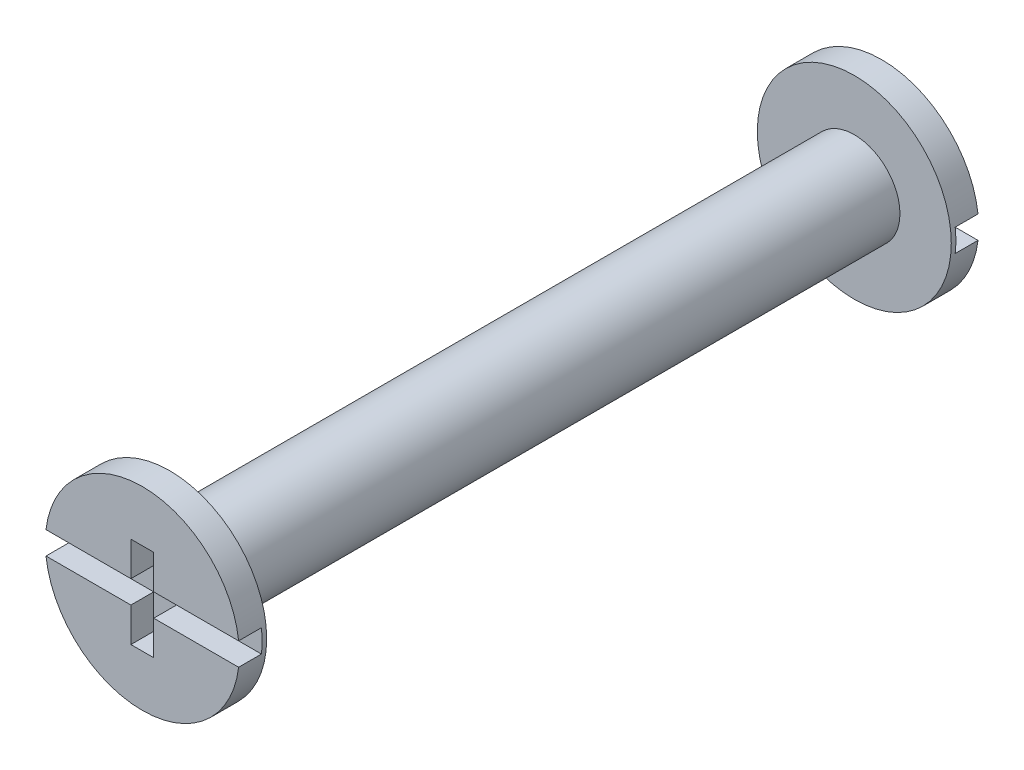
ISO-10303-21;
HEADER;
FILE_DESCRIPTION(('STEP AP214'),'2;1');
FILE_NAME('part.step','',(''),(''),'','','');
FILE_SCHEMA(('AUTOMOTIVE_DESIGN { 1 0 10303 214 1 1 1 1 }'));
ENDSEC;
DATA;
#1=APPLICATION_CONTEXT('core data for automotive mechanical design processes');
#2=APPLICATION_PROTOCOL_DEFINITION('international standard','automotive_design',2000,#1);
#3=PRODUCT_CONTEXT('',#1,'mechanical');
#4=PRODUCT('Part','Part','',(#3));
#5=PRODUCT_RELATED_PRODUCT_CATEGORY('part','',(#4));
#6=PRODUCT_DEFINITION_FORMATION('','',#4);
#7=PRODUCT_DEFINITION_CONTEXT('part definition',#1,'design');
#8=PRODUCT_DEFINITION('design','',#6,#7);
#9=PRODUCT_DEFINITION_SHAPE('','',#8);
#10=(LENGTH_UNIT() NAMED_UNIT(*) SI_UNIT(.MILLI.,.METRE.));
#11=(NAMED_UNIT(*) PLANE_ANGLE_UNIT() SI_UNIT($,.RADIAN.));
#12=(NAMED_UNIT(*) SI_UNIT($,.STERADIAN.) SOLID_ANGLE_UNIT());
#13=UNCERTAINTY_MEASURE_WITH_UNIT(LENGTH_MEASURE(1.E-05),#10,'distance_accuracy_value','');
#14=(GEOMETRIC_REPRESENTATION_CONTEXT(3) GLOBAL_UNCERTAINTY_ASSIGNED_CONTEXT((#13)) GLOBAL_UNIT_ASSIGNED_CONTEXT((#10,
#11,#12)) REPRESENTATION_CONTEXT('',''));
#15=CARTESIAN_POINT('',(0.,0.,0.));
#16=DIRECTION('',(0.,0.,1.));
#17=DIRECTION('',(1.,0.,0.));
#18=AXIS2_PLACEMENT_3D('',#15,#16,#17);
#19=CARTESIAN_POINT('',(0.,0.,0.));
#20=DIRECTION('',(0.,0.,1.));
#21=DIRECTION('',(1.,0.,0.));
#22=AXIS2_PLACEMENT_3D('',#19,#20,#21);
#23=PLANE('',#22);
#24=CARTESIAN_POINT('',(0.,0.,0.));
#25=DIRECTION('',(0.,0.,1.));
#26=DIRECTION('',(1.,0.,0.));
#27=AXIS2_PLACEMENT_3D('',#24,#25,#26);
#28=CIRCLE('',#27,4.25);
#29=CARTESIAN_POINT('',(4.22048575403353,0.5,0.));
#30=VERTEX_POINT('',#29);
#31=CARTESIAN_POINT('',(-4.22048575403353,0.5,0.));
#32=VERTEX_POINT('',#31);
#33=EDGE_CURVE('E166',#30,#32,#28,.T.);
#34=ORIENTED_EDGE('',*,*,#33,.F.);
#35=DIRECTION('',(-1.,0.,0.));
#36=VECTOR('',#35,1.);
#37=CARTESIAN_POINT('',(0.,0.5,0.));
#38=LINE('',#37,#36);
#39=EDGE_CURVE('E154',#30,#32,#38,.T.);
#40=ORIENTED_EDGE('',*,*,#39,.T.);
#41=EDGE_LOOP('',(#34,#40));
#42=FACE_BOUND('',#41,.T.);
#43=ADVANCED_FACE('F35',(#42),#23,.F.);
#44=CARTESIAN_POINT('',(0.,0.,32.4));
#45=DIRECTION('',(0.,0.,1.));
#46=DIRECTION('',(1.,0.,0.));
#47=AXIS2_PLACEMENT_3D('',#44,#45,#46);
#48=PLANE('',#47);
#49=DIRECTION('',(1.,0.,0.));
#50=VECTOR('',#49,1.);
#51=CARTESIAN_POINT('',(0.5,-0.5,32.4));
#52=LINE('',#51,#50);
#53=CARTESIAN_POINT('',(0.5,-0.5,32.4));
#54=VERTEX_POINT('',#53);
#55=CARTESIAN_POINT('',(4.22048575403353,-0.5,32.4));
#56=VERTEX_POINT('',#55);
#57=EDGE_CURVE('E204',#54,#56,#52,.T.);
#58=ORIENTED_EDGE('',*,*,#57,.F.);
#59=DIRECTION('',(0.,1.,0.));
#60=VECTOR('',#59,1.);
#61=CARTESIAN_POINT('',(0.5,-0.5,32.4));
#62=LINE('',#61,#60);
#63=CARTESIAN_POINT('',(0.5,-2.,32.4));
#64=VERTEX_POINT('',#63);
#65=EDGE_CURVE('E247',#64,#54,#62,.T.);
#66=ORIENTED_EDGE('',*,*,#65,.F.);
#67=DIRECTION('',(1.,0.,0.));
#68=VECTOR('',#67,1.);
#69=CARTESIAN_POINT('',(-0.5,-2.,32.4));
#70=LINE('',#69,#68);
#71=CARTESIAN_POINT('',(-0.5,-2.,32.4));
#72=VERTEX_POINT('',#71);
#73=EDGE_CURVE('E244',#72,#64,#70,.T.);
#74=ORIENTED_EDGE('',*,*,#73,.F.);
#75=DIRECTION('',(0.,-1.,0.));
#76=VECTOR('',#75,1.);
#77=CARTESIAN_POINT('',(-0.5,-0.5,32.4));
#78=LINE('',#77,#76);
#79=CARTESIAN_POINT('',(-0.5,-0.5,32.4));
#80=VERTEX_POINT('',#79);
#81=EDGE_CURVE('E241',#80,#72,#78,.T.);
#82=ORIENTED_EDGE('',*,*,#81,.F.);
#83=DIRECTION('',(1.,0.,0.));
#84=VECTOR('',#83,1.);
#85=CARTESIAN_POINT('',(0.,-0.5,32.4));
#86=LINE('',#85,#84);
#87=CARTESIAN_POINT('',(-4.22048575403353,-0.5,32.4));
#88=VERTEX_POINT('',#87);
#89=EDGE_CURVE('E179',#88,#80,#86,.T.);
#90=ORIENTED_EDGE('',*,*,#89,.F.);
#91=CARTESIAN_POINT('',(0.,0.,32.4));
#92=DIRECTION('',(0.,0.,1.));
#93=DIRECTION('',(1.,0.,0.));
#94=AXIS2_PLACEMENT_3D('',#91,#92,#93);
#95=CIRCLE('',#94,4.25);
#96=EDGE_CURVE('E282',#88,#56,#95,.T.);
#97=ORIENTED_EDGE('',*,*,#96,.T.);
#98=EDGE_LOOP('',(#58,#66,#74,#82,#90,#97));
#99=FACE_BOUND('',#98,.T.);
#100=ADVANCED_FACE('F291',(#99),#48,.T.);
#101=CARTESIAN_POINT('',(0.,0.,1.2));
#102=DIRECTION('',(0.,0.,1.));
#103=DIRECTION('',(1.,0.,0.));
#104=AXIS2_PLACEMENT_3D('',#101,#102,#103);
#105=PLANE('',#104);
#106=CARTESIAN_POINT('',(0.,0.,1.2));
#107=DIRECTION('',(0.,0.,1.));
#108=DIRECTION('',(1.,0.,0.));
#109=AXIS2_PLACEMENT_3D('',#106,#107,#108);
#110=CIRCLE('',#109,4.25);
#111=CARTESIAN_POINT('',(4.25,0.,1.2));
#112=VERTEX_POINT('',#111);
#113=EDGE_CURVE('E170',#112,#112,#110,.T.);
#114=ORIENTED_EDGE('',*,*,#113,.T.);
#115=EDGE_LOOP('',(#114));
#116=FACE_BOUND('',#115,.T.);
#117=CARTESIAN_POINT('',(0.,0.,1.2));
#118=DIRECTION('',(0.,0.,1.));
#119=DIRECTION('',(1.,0.,0.));
#120=AXIS2_PLACEMENT_3D('',#117,#118,#119);
#121=CIRCLE('',#120,2.);
#122=CARTESIAN_POINT('',(2.,0.,1.2));
#123=VERTEX_POINT('',#122);
#124=EDGE_CURVE('E172',#123,#123,#121,.T.);
#125=ORIENTED_EDGE('',*,*,#124,.F.);
#126=EDGE_LOOP('',(#125));
#127=FACE_BOUND('',#126,.T.);
#128=ADVANCED_FACE('F289',(#116,#127),#105,.T.);
#129=CARTESIAN_POINT('',(0.,0.,1.2));
#130=DIRECTION('',(0.,0.,-1.));
#131=DIRECTION('',(-1.,0.,0.));
#132=AXIS2_PLACEMENT_3D('',#129,#130,#131);
#133=CYLINDRICAL_SURFACE('',#132,4.25);
#134=CARTESIAN_POINT('',(0.,0.,1.));
#135=DIRECTION('',(0.,0.,-1.));
#136=DIRECTION('',(-1.,0.,0.));
#137=AXIS2_PLACEMENT_3D('',#134,#135,#136);
#138=CIRCLE('',#137,4.25);
#139=CARTESIAN_POINT('',(4.22048575403353,0.5,1.));
#140=VERTEX_POINT('',#139);
#141=CARTESIAN_POINT('',(4.22048575403353,-0.5,1.));
#142=VERTEX_POINT('',#141);
#143=EDGE_CURVE('E11',#140,#142,#138,.T.);
#144=ORIENTED_EDGE('',*,*,#143,.F.);
#145=DIRECTION('',(0.,0.,-1.));
#146=VECTOR('',#145,1.);
#147=CARTESIAN_POINT('',(4.22048575403353,0.5,1.2));
#148=LINE('',#147,#146);
#149=EDGE_CURVE('E194',#140,#30,#148,.T.);
#150=ORIENTED_EDGE('',*,*,#149,.T.);
#151=ORIENTED_EDGE('',*,*,#33,.T.);
#152=DIRECTION('',(0.,0.,-1.));
#153=VECTOR('',#152,1.);
#154=CARTESIAN_POINT('',(-4.22048575403353,0.5,1.2));
#155=LINE('',#154,#153);
#156=CARTESIAN_POINT('',(-4.22048575403353,0.5,1.));
#157=VERTEX_POINT('',#156);
#158=EDGE_CURVE('E163',#32,#157,#155,.F.);
#159=ORIENTED_EDGE('',*,*,#158,.T.);
#160=CARTESIAN_POINT('',(-4.22048575403353,-0.5,1.));
#161=VERTEX_POINT('',#160);
#162=EDGE_CURVE('E39',#161,#157,#138,.T.);
#163=ORIENTED_EDGE('',*,*,#162,.F.);
#164=DIRECTION('',(0.,0.,-1.));
#165=VECTOR('',#164,1.);
#166=CARTESIAN_POINT('',(-4.22048575403353,-0.5,1.2));
#167=LINE('',#166,#165);
#168=CARTESIAN_POINT('',(-4.22048575403353,-0.5,0.));
#169=VERTEX_POINT('',#168);
#170=EDGE_CURVE('E149',#161,#169,#167,.T.);
#171=ORIENTED_EDGE('',*,*,#170,.T.);
#172=CARTESIAN_POINT('',(4.22048575403353,-0.5,0.));
#173=VERTEX_POINT('',#172);
#174=EDGE_CURVE('E161',#169,#173,#28,.T.);
#175=ORIENTED_EDGE('',*,*,#174,.T.);
#176=DIRECTION('',(0.,0.,-1.));
#177=VECTOR('',#176,1.);
#178=CARTESIAN_POINT('',(4.22048575403353,-0.5,1.2));
#179=LINE('',#178,#177);
#180=EDGE_CURVE('E50',#173,#142,#179,.F.);
#181=ORIENTED_EDGE('',*,*,#180,.T.);
#182=EDGE_LOOP('',(#144,#150,#151,#159,#163,#171,#175,#181));
#183=FACE_BOUND('',#182,.T.);
#184=ORIENTED_EDGE('',*,*,#113,.F.);
#185=EDGE_LOOP('',(#184));
#186=FACE_BOUND('',#185,.T.);
#187=ADVANCED_FACE('F37',(#183,#186),#133,.T.);
#188=ORIENTED_EDGE('',*,*,#174,.F.);
#189=DIRECTION('',(1.,0.,0.));
#190=VECTOR('',#189,1.);
#191=CARTESIAN_POINT('',(0.,-0.5,0.));
#192=LINE('',#191,#190);
#193=EDGE_CURVE('E146',#169,#173,#192,.T.);
#194=ORIENTED_EDGE('',*,*,#193,.T.);
#195=EDGE_LOOP('',(#188,#194));
#196=FACE_BOUND('',#195,.T.);
#197=ADVANCED_FACE('F165',(#196),#23,.F.);
#198=CARTESIAN_POINT('',(0.,0.,31.2));
#199=DIRECTION('',(0.,0.,-1.));
#200=DIRECTION('',(-1.,0.,0.));
#201=AXIS2_PLACEMENT_3D('',#198,#199,#200);
#202=CYLINDRICAL_SURFACE('',#201,2.);
#203=CARTESIAN_POINT('',(0.,0.,31.2));
#204=DIRECTION('',(0.,0.,1.));
#205=DIRECTION('',(1.,0.,0.));
#206=AXIS2_PLACEMENT_3D('',#203,#204,#205);
#207=CIRCLE('',#206,2.);
#208=CARTESIAN_POINT('',(2.,0.,31.2));
#209=VERTEX_POINT('',#208);
#210=EDGE_CURVE('E167',#209,#209,#207,.T.);
#211=ORIENTED_EDGE('',*,*,#210,.F.);
#212=EDGE_LOOP('',(#211));
#213=FACE_BOUND('',#212,.T.);
#214=ORIENTED_EDGE('',*,*,#124,.T.);
#215=EDGE_LOOP('',(#214));
#216=FACE_BOUND('',#215,.T.);
#217=ADVANCED_FACE('F287',(#213,#216),#202,.T.);
#218=CARTESIAN_POINT('',(0.,0.,31.2));
#219=DIRECTION('',(0.,0.,1.));
#220=DIRECTION('',(1.,0.,0.));
#221=AXIS2_PLACEMENT_3D('',#218,#219,#220);
#222=PLANE('',#221);
#223=CARTESIAN_POINT('',(0.,0.,31.2));
#224=DIRECTION('',(0.,0.,1.));
#225=DIRECTION('',(1.,0.,0.));
#226=AXIS2_PLACEMENT_3D('',#223,#224,#225);
#227=CIRCLE('',#226,4.25);
#228=CARTESIAN_POINT('',(4.25,0.,31.2));
#229=VERTEX_POINT('',#228);
#230=EDGE_CURVE('E278',#229,#229,#227,.T.);
#231=ORIENTED_EDGE('',*,*,#230,.F.);
#232=EDGE_LOOP('',(#231));
#233=FACE_BOUND('',#232,.T.);
#234=ORIENTED_EDGE('',*,*,#210,.T.);
#235=EDGE_LOOP('',(#234));
#236=FACE_BOUND('',#235,.T.);
#237=ADVANCED_FACE('F310',(#233,#236),#222,.F.);
#238=CARTESIAN_POINT('',(0.,0.,32.4));
#239=DIRECTION('',(0.,0.,-1.));
#240=DIRECTION('',(-1.,0.,0.));
#241=AXIS2_PLACEMENT_3D('',#238,#239,#240);
#242=CYLINDRICAL_SURFACE('',#241,4.25);
#243=ORIENTED_EDGE('',*,*,#96,.F.);
#244=DIRECTION('',(0.,0.,-1.));
#245=VECTOR('',#244,1.);
#246=CARTESIAN_POINT('',(-4.22048575403353,-0.5,32.4));
#247=LINE('',#246,#245);
#248=CARTESIAN_POINT('',(-4.22048575403353,-0.5,31.4));
#249=VERTEX_POINT('',#248);
#250=EDGE_CURVE('E272',#88,#249,#247,.T.);
#251=ORIENTED_EDGE('',*,*,#250,.T.);
#252=CARTESIAN_POINT('',(0.,0.,31.4));
#253=DIRECTION('',(0.,0.,1.));
#254=DIRECTION('',(1.,0.,0.));
#255=AXIS2_PLACEMENT_3D('',#252,#253,#254);
#256=CIRCLE('',#255,4.25);
#257=CARTESIAN_POINT('',(-4.22048575403353,0.5,31.4));
#258=VERTEX_POINT('',#257);
#259=EDGE_CURVE('E155',#258,#249,#256,.T.);
#260=ORIENTED_EDGE('',*,*,#259,.F.);
#261=DIRECTION('',(0.,0.,-1.));
#262=VECTOR('',#261,1.);
#263=CARTESIAN_POINT('',(-4.22048575403353,0.5,32.4));
#264=LINE('',#263,#262);
#265=CARTESIAN_POINT('',(-4.22048575403353,0.5,32.4));
#266=VERTEX_POINT('',#265);
#267=EDGE_CURVE('E269',#258,#266,#264,.F.);
#268=ORIENTED_EDGE('',*,*,#267,.T.);
#269=CARTESIAN_POINT('',(4.22048575403353,0.5,32.4));
#270=VERTEX_POINT('',#269);
#271=EDGE_CURVE('E279',#270,#266,#95,.T.);
#272=ORIENTED_EDGE('',*,*,#271,.F.);
#273=DIRECTION('',(0.,0.,-1.));
#274=VECTOR('',#273,1.);
#275=CARTESIAN_POINT('',(4.22048575403353,0.5,32.4));
#276=LINE('',#275,#274);
#277=CARTESIAN_POINT('',(4.22048575403353,0.5,31.4));
#278=VERTEX_POINT('',#277);
#279=EDGE_CURVE('E58',#270,#278,#276,.T.);
#280=ORIENTED_EDGE('',*,*,#279,.T.);
#281=CARTESIAN_POINT('',(4.22048575403353,-0.5,31.4));
#282=VERTEX_POINT('',#281);
#283=EDGE_CURVE('E181',#282,#278,#256,.T.);
#284=ORIENTED_EDGE('',*,*,#283,.F.);
#285=DIRECTION('',(0.,0.,-1.));
#286=VECTOR('',#285,1.);
#287=CARTESIAN_POINT('',(4.22048575403353,-0.5,32.4));
#288=LINE('',#287,#286);
#289=EDGE_CURVE('E275',#282,#56,#288,.F.);
#290=ORIENTED_EDGE('',*,*,#289,.T.);
#291=EDGE_LOOP('',(#243,#251,#260,#268,#272,#280,#284,#290));
#292=FACE_BOUND('',#291,.T.);
#293=ORIENTED_EDGE('',*,*,#230,.T.);
#294=EDGE_LOOP('',(#293));
#295=FACE_BOUND('',#294,.T.);
#296=ADVANCED_FACE('F315',(#292,#295),#242,.T.);
#297=DIRECTION('',(-1.,0.,0.));
#298=VECTOR('',#297,1.);
#299=CARTESIAN_POINT('',(-4.7236109069228,0.5,32.4));
#300=LINE('',#299,#298);
#301=CARTESIAN_POINT('',(-0.5,0.5,32.4));
#302=VERTEX_POINT('',#301);
#303=EDGE_CURVE('E239',#302,#266,#300,.T.);
#304=ORIENTED_EDGE('',*,*,#303,.F.);
#305=DIRECTION('',(0.,-1.,0.));
#306=VECTOR('',#305,1.);
#307=CARTESIAN_POINT('',(-0.5,2.,32.4));
#308=LINE('',#307,#306);
#309=CARTESIAN_POINT('',(-0.5,2.,32.4));
#310=VERTEX_POINT('',#309);
#311=EDGE_CURVE('E236',#310,#302,#308,.T.);
#312=ORIENTED_EDGE('',*,*,#311,.F.);
#313=DIRECTION('',(-1.,0.,0.));
#314=VECTOR('',#313,1.);
#315=CARTESIAN_POINT('',(-0.5,2.,32.4));
#316=LINE('',#315,#314);
#317=CARTESIAN_POINT('',(0.5,2.,32.4));
#318=VERTEX_POINT('',#317);
#319=EDGE_CURVE('E233',#318,#310,#316,.T.);
#320=ORIENTED_EDGE('',*,*,#319,.F.);
#321=DIRECTION('',(0.,1.,0.));
#322=VECTOR('',#321,1.);
#323=CARTESIAN_POINT('',(0.5,2.,32.4));
#324=LINE('',#323,#322);
#325=CARTESIAN_POINT('',(0.5,0.5,32.4));
#326=VERTEX_POINT('',#325);
#327=EDGE_CURVE('E197',#326,#318,#324,.T.);
#328=ORIENTED_EDGE('',*,*,#327,.F.);
#329=DIRECTION('',(-1.,0.,0.));
#330=VECTOR('',#329,1.);
#331=CARTESIAN_POINT('',(0.,0.5,32.4));
#332=LINE('',#331,#330);
#333=EDGE_CURVE('E177',#270,#326,#332,.T.);
#334=ORIENTED_EDGE('',*,*,#333,.F.);
#335=ORIENTED_EDGE('',*,*,#271,.T.);
#336=EDGE_LOOP('',(#304,#312,#320,#328,#334,#335));
#337=FACE_BOUND('',#336,.T.);
#338=ADVANCED_FACE('F300',(#337),#48,.T.);
#339=CARTESIAN_POINT('',(0.,0.,31.4));
#340=DIRECTION('',(0.,0.,1.));
#341=DIRECTION('',(1.,0.,0.));
#342=AXIS2_PLACEMENT_3D('',#339,#340,#341);
#343=PLANE('',#342);
#344=ORIENTED_EDGE('',*,*,#259,.T.);
#345=DIRECTION('',(1.,0.,0.));
#346=VECTOR('',#345,1.);
#347=CARTESIAN_POINT('',(-4.7236109069228,-0.5,31.4));
#348=LINE('',#347,#346);
#349=CARTESIAN_POINT('',(-0.5,-0.5,31.4));
#350=VERTEX_POINT('',#349);
#351=EDGE_CURVE('E216',#249,#350,#348,.T.);
#352=ORIENTED_EDGE('',*,*,#351,.T.);
#353=DIRECTION('',(0.,-1.,0.));
#354=VECTOR('',#353,1.);
#355=CARTESIAN_POINT('',(-0.5,-0.5,31.4));
#356=LINE('',#355,#354);
#357=CARTESIAN_POINT('',(-0.5,-2.,31.4));
#358=VERTEX_POINT('',#357);
#359=EDGE_CURVE('E218',#350,#358,#356,.T.);
#360=ORIENTED_EDGE('',*,*,#359,.T.);
#361=DIRECTION('',(1.,0.,0.));
#362=VECTOR('',#361,1.);
#363=CARTESIAN_POINT('',(-0.5,-2.,31.4));
#364=LINE('',#363,#362);
#365=CARTESIAN_POINT('',(0.5,-2.,31.4));
#366=VERTEX_POINT('',#365);
#367=EDGE_CURVE('E221',#358,#366,#364,.T.);
#368=ORIENTED_EDGE('',*,*,#367,.T.);
#369=DIRECTION('',(0.,1.,0.));
#370=VECTOR('',#369,1.);
#371=CARTESIAN_POINT('',(0.5,-0.5,31.4));
#372=LINE('',#371,#370);
#373=CARTESIAN_POINT('',(0.5,-0.5,31.4));
#374=VERTEX_POINT('',#373);
#375=EDGE_CURVE('E224',#366,#374,#372,.T.);
#376=ORIENTED_EDGE('',*,*,#375,.T.);
#377=DIRECTION('',(1.,0.,0.));
#378=VECTOR('',#377,1.);
#379=CARTESIAN_POINT('',(0.5,-0.5,31.4));
#380=LINE('',#379,#378);
#381=EDGE_CURVE('E227',#374,#282,#380,.T.);
#382=ORIENTED_EDGE('',*,*,#381,.T.);
#383=ORIENTED_EDGE('',*,*,#283,.T.);
#384=DIRECTION('',(-1.,0.,0.));
#385=VECTOR('',#384,1.);
#386=CARTESIAN_POINT('',(0.5,0.5,31.4));
#387=LINE('',#386,#385);
#388=CARTESIAN_POINT('',(0.5,0.5,31.4));
#389=VERTEX_POINT('',#388);
#390=EDGE_CURVE('E201',#278,#389,#387,.T.);
#391=ORIENTED_EDGE('',*,*,#390,.T.);
#392=DIRECTION('',(0.,1.,0.));
#393=VECTOR('',#392,1.);
#394=CARTESIAN_POINT('',(0.5,2.,31.4));
#395=LINE('',#394,#393);
#396=CARTESIAN_POINT('',(0.5,2.,31.4));
#397=VERTEX_POINT('',#396);
#398=EDGE_CURVE('E203',#389,#397,#395,.T.);
#399=ORIENTED_EDGE('',*,*,#398,.T.);
#400=DIRECTION('',(-1.,0.,0.));
#401=VECTOR('',#400,1.);
#402=CARTESIAN_POINT('',(-0.5,2.,31.4));
#403=LINE('',#402,#401);
#404=CARTESIAN_POINT('',(-0.5,2.,31.4));
#405=VERTEX_POINT('',#404);
#406=EDGE_CURVE('E207',#397,#405,#403,.T.);
#407=ORIENTED_EDGE('',*,*,#406,.T.);
#408=DIRECTION('',(0.,-1.,0.));
#409=VECTOR('',#408,1.);
#410=CARTESIAN_POINT('',(-0.5,2.,31.4));
#411=LINE('',#410,#409);
#412=CARTESIAN_POINT('',(-0.5,0.5,31.4));
#413=VERTEX_POINT('',#412);
#414=EDGE_CURVE('E210',#405,#413,#411,.T.);
#415=ORIENTED_EDGE('',*,*,#414,.T.);
#416=DIRECTION('',(-1.,0.,0.));
#417=VECTOR('',#416,1.);
#418=CARTESIAN_POINT('',(-4.7236109069228,0.5,31.4));
#419=LINE('',#418,#417);
#420=EDGE_CURVE('E213',#413,#258,#419,.T.);
#421=ORIENTED_EDGE('',*,*,#420,.T.);
#422=EDGE_LOOP('',(#344,#352,#360,#368,#376,#382,#383,#391,#399,#407,#415,#421));
#423=FACE_BOUND('',#422,.T.);
#424=ADVANCED_FACE('F324',(#423),#343,.T.);
#425=CARTESIAN_POINT('',(0.5,-0.5,31.4));
#426=DIRECTION('',(0.,-1.,0.));
#427=DIRECTION('',(0.,0.,-1.));
#428=AXIS2_PLACEMENT_3D('',#425,#426,#427);
#429=PLANE('',#428);
#430=ORIENTED_EDGE('',*,*,#381,.F.);
#431=DIRECTION('',(0.,0.,1.));
#432=VECTOR('',#431,1.);
#433=CARTESIAN_POINT('',(0.5,-0.5,31.4));
#434=LINE('',#433,#432);
#435=EDGE_CURVE('E251',#374,#54,#434,.T.);
#436=ORIENTED_EDGE('',*,*,#435,.T.);
#437=ORIENTED_EDGE('',*,*,#57,.T.);
#438=ORIENTED_EDGE('',*,*,#289,.F.);
#439=EDGE_LOOP('',(#430,#436,#437,#438));
#440=FACE_BOUND('',#439,.T.);
#441=ADVANCED_FACE('F350',(#440),#429,.F.);
#442=CARTESIAN_POINT('',(-4.7236109069228,-0.5,31.4));
#443=DIRECTION('',(0.,-1.,0.));
#444=DIRECTION('',(0.,0.,-1.));
#445=AXIS2_PLACEMENT_3D('',#442,#443,#444);
#446=PLANE('',#445);
#447=ORIENTED_EDGE('',*,*,#89,.T.);
#448=DIRECTION('',(0.,0.,1.));
#449=VECTOR('',#448,1.);
#450=CARTESIAN_POINT('',(-0.5,-0.5,31.4));
#451=LINE('',#450,#449);
#452=EDGE_CURVE('E257',#350,#80,#451,.T.);
#453=ORIENTED_EDGE('',*,*,#452,.F.);
#454=ORIENTED_EDGE('',*,*,#351,.F.);
#455=ORIENTED_EDGE('',*,*,#250,.F.);
#456=EDGE_LOOP('',(#447,#453,#454,#455));
#457=FACE_BOUND('',#456,.T.);
#458=ADVANCED_FACE('F346',(#457),#446,.F.);
#459=CARTESIAN_POINT('',(-4.7236109069228,0.5,31.4));
#460=DIRECTION('',(0.,1.,0.));
#461=DIRECTION('',(0.,0.,1.));
#462=AXIS2_PLACEMENT_3D('',#459,#460,#461);
#463=PLANE('',#462);
#464=ORIENTED_EDGE('',*,*,#420,.F.);
#465=DIRECTION('',(0.,0.,1.));
#466=VECTOR('',#465,1.);
#467=CARTESIAN_POINT('',(-0.5,0.5,31.4));
#468=LINE('',#467,#466);
#469=EDGE_CURVE('E260',#413,#302,#468,.T.);
#470=ORIENTED_EDGE('',*,*,#469,.T.);
#471=ORIENTED_EDGE('',*,*,#303,.T.);
#472=ORIENTED_EDGE('',*,*,#267,.F.);
#473=EDGE_LOOP('',(#464,#470,#471,#472));
#474=FACE_BOUND('',#473,.T.);
#475=ADVANCED_FACE('F330',(#474),#463,.F.);
#476=CARTESIAN_POINT('',(0.5,0.5,31.4));
#477=DIRECTION('',(0.,1.,0.));
#478=DIRECTION('',(0.,0.,1.));
#479=AXIS2_PLACEMENT_3D('',#476,#477,#478);
#480=PLANE('',#479);
#481=ORIENTED_EDGE('',*,*,#333,.T.);
#482=DIRECTION('',(0.,0.,1.));
#483=VECTOR('',#482,1.);
#484=CARTESIAN_POINT('',(0.5,0.5,31.4));
#485=LINE('',#484,#483);
#486=EDGE_CURVE('E230',#389,#326,#485,.T.);
#487=ORIENTED_EDGE('',*,*,#486,.F.);
#488=ORIENTED_EDGE('',*,*,#390,.F.);
#489=ORIENTED_EDGE('',*,*,#279,.F.);
#490=EDGE_LOOP('',(#481,#487,#488,#489));
#491=FACE_BOUND('',#490,.T.);
#492=ADVANCED_FACE('F326',(#491),#480,.F.);
#493=CARTESIAN_POINT('',(0.5,-0.5,31.4));
#494=DIRECTION('',(1.,0.,0.));
#495=DIRECTION('',(0.,1.,0.));
#496=AXIS2_PLACEMENT_3D('',#493,#494,#495);
#497=PLANE('',#496);
#498=ORIENTED_EDGE('',*,*,#65,.T.);
#499=ORIENTED_EDGE('',*,*,#435,.F.);
#500=ORIENTED_EDGE('',*,*,#375,.F.);
#501=DIRECTION('',(0.,0.,1.));
#502=VECTOR('',#501,1.);
#503=CARTESIAN_POINT('',(0.5,-2.,31.4));
#504=LINE('',#503,#502);
#505=EDGE_CURVE('E253',#366,#64,#504,.T.);
#506=ORIENTED_EDGE('',*,*,#505,.T.);
#507=EDGE_LOOP('',(#498,#499,#500,#506));
#508=FACE_BOUND('',#507,.T.);
#509=ADVANCED_FACE('F329',(#508),#497,.F.);
#510=CARTESIAN_POINT('',(-0.5,-2.,31.4));
#511=DIRECTION('',(0.,-1.,0.));
#512=DIRECTION('',(0.,0.,-1.));
#513=AXIS2_PLACEMENT_3D('',#510,#511,#512);
#514=PLANE('',#513);
#515=ORIENTED_EDGE('',*,*,#73,.T.);
#516=ORIENTED_EDGE('',*,*,#505,.F.);
#517=ORIENTED_EDGE('',*,*,#367,.F.);
#518=DIRECTION('',(0.,0.,1.));
#519=VECTOR('',#518,1.);
#520=CARTESIAN_POINT('',(-0.5,-2.,31.4));
#521=LINE('',#520,#519);
#522=EDGE_CURVE('E255',#358,#72,#521,.T.);
#523=ORIENTED_EDGE('',*,*,#522,.T.);
#524=EDGE_LOOP('',(#515,#516,#517,#523));
#525=FACE_BOUND('',#524,.T.);
#526=ADVANCED_FACE('F354',(#525),#514,.F.);
#527=CARTESIAN_POINT('',(-0.5,-0.5,31.4));
#528=DIRECTION('',(-1.,0.,0.));
#529=DIRECTION('',(0.,-1.,0.));
#530=AXIS2_PLACEMENT_3D('',#527,#528,#529);
#531=PLANE('',#530);
#532=ORIENTED_EDGE('',*,*,#81,.T.);
#533=ORIENTED_EDGE('',*,*,#522,.F.);
#534=ORIENTED_EDGE('',*,*,#359,.F.);
#535=ORIENTED_EDGE('',*,*,#452,.T.);
#536=EDGE_LOOP('',(#532,#533,#534,#535));
#537=FACE_BOUND('',#536,.T.);
#538=ADVANCED_FACE('F342',(#537),#531,.F.);
#539=CARTESIAN_POINT('',(-0.5,2.,31.4));
#540=DIRECTION('',(-1.,0.,0.));
#541=DIRECTION('',(0.,-1.,0.));
#542=AXIS2_PLACEMENT_3D('',#539,#540,#541);
#543=PLANE('',#542);
#544=ORIENTED_EDGE('',*,*,#311,.T.);
#545=ORIENTED_EDGE('',*,*,#469,.F.);
#546=ORIENTED_EDGE('',*,*,#414,.F.);
#547=DIRECTION('',(0.,0.,1.));
#548=VECTOR('',#547,1.);
#549=CARTESIAN_POINT('',(-0.5,2.,31.4));
#550=LINE('',#549,#548);
#551=EDGE_CURVE('E262',#405,#310,#550,.T.);
#552=ORIENTED_EDGE('',*,*,#551,.T.);
#553=EDGE_LOOP('',(#544,#545,#546,#552));
#554=FACE_BOUND('',#553,.T.);
#555=ADVANCED_FACE('F338',(#554),#543,.F.);
#556=CARTESIAN_POINT('',(-0.5,2.,31.4));
#557=DIRECTION('',(0.,1.,0.));
#558=DIRECTION('',(0.,0.,1.));
#559=AXIS2_PLACEMENT_3D('',#556,#557,#558);
#560=PLANE('',#559);
#561=ORIENTED_EDGE('',*,*,#319,.T.);
#562=ORIENTED_EDGE('',*,*,#551,.F.);
#563=ORIENTED_EDGE('',*,*,#406,.F.);
#564=DIRECTION('',(0.,0.,1.));
#565=VECTOR('',#564,1.);
#566=CARTESIAN_POINT('',(0.5,2.,31.4));
#567=LINE('',#566,#565);
#568=EDGE_CURVE('E264',#397,#318,#567,.T.);
#569=ORIENTED_EDGE('',*,*,#568,.T.);
#570=EDGE_LOOP('',(#561,#562,#563,#569));
#571=FACE_BOUND('',#570,.T.);
#572=ADVANCED_FACE('F334',(#571),#560,.F.);
#573=CARTESIAN_POINT('',(0.5,2.,31.4));
#574=DIRECTION('',(1.,0.,0.));
#575=DIRECTION('',(0.,0.,-1.));
#576=AXIS2_PLACEMENT_3D('',#573,#574,#575);
#577=PLANE('',#576);
#578=ORIENTED_EDGE('',*,*,#327,.T.);
#579=ORIENTED_EDGE('',*,*,#568,.F.);
#580=ORIENTED_EDGE('',*,*,#398,.F.);
#581=ORIENTED_EDGE('',*,*,#486,.T.);
#582=EDGE_LOOP('',(#578,#579,#580,#581));
#583=FACE_BOUND('',#582,.T.);
#584=ADVANCED_FACE('F331',(#583),#577,.F.);
#585=CARTESIAN_POINT('',(0.,0.,1.));
#586=DIRECTION('',(0.,0.,-1.));
#587=DIRECTION('',(-1.,0.,0.));
#588=AXIS2_PLACEMENT_3D('',#585,#586,#587);
#589=PLANE('',#588);
#590=ORIENTED_EDGE('',*,*,#143,.T.);
#591=DIRECTION('',(-1.,0.,0.));
#592=VECTOR('',#591,1.);
#593=CARTESIAN_POINT('',(4.7236109069228,-0.5,1.));
#594=LINE('',#593,#592);
#595=EDGE_CURVE('E190',#142,#161,#594,.T.);
#596=ORIENTED_EDGE('',*,*,#595,.T.);
#597=ORIENTED_EDGE('',*,*,#162,.T.);
#598=DIRECTION('',(1.,0.,0.));
#599=VECTOR('',#598,1.);
#600=CARTESIAN_POINT('',(4.7236109069228,0.5,1.));
#601=LINE('',#600,#599);
#602=EDGE_CURVE('E189',#157,#140,#601,.T.);
#603=ORIENTED_EDGE('',*,*,#602,.T.);
#604=EDGE_LOOP('',(#590,#596,#597,#603));
#605=FACE_BOUND('',#604,.T.);
#606=ADVANCED_FACE('F188',(#605),#589,.T.);
#607=CARTESIAN_POINT('',(4.7236109069228,0.5,1.));
#608=DIRECTION('',(0.,1.,0.));
#609=DIRECTION('',(0.,0.,1.));
#610=AXIS2_PLACEMENT_3D('',#607,#608,#609);
#611=PLANE('',#610);
#612=ORIENTED_EDGE('',*,*,#602,.F.);
#613=ORIENTED_EDGE('',*,*,#158,.F.);
#614=ORIENTED_EDGE('',*,*,#39,.F.);
#615=ORIENTED_EDGE('',*,*,#149,.F.);
#616=EDGE_LOOP('',(#612,#613,#614,#615));
#617=FACE_BOUND('',#616,.T.);
#618=ADVANCED_FACE('F192',(#617),#611,.F.);
#619=CARTESIAN_POINT('',(4.7236109069228,-0.5,1.));
#620=DIRECTION('',(0.,-1.,0.));
#621=DIRECTION('',(0.,0.,-1.));
#622=AXIS2_PLACEMENT_3D('',#619,#620,#621);
#623=PLANE('',#622);
#624=ORIENTED_EDGE('',*,*,#595,.F.);
#625=ORIENTED_EDGE('',*,*,#180,.F.);
#626=ORIENTED_EDGE('',*,*,#193,.F.);
#627=ORIENTED_EDGE('',*,*,#170,.F.);
#628=EDGE_LOOP('',(#624,#625,#626,#627));
#629=FACE_BOUND('',#628,.T.);
#630=ADVANCED_FACE('F148',(#629),#623,.F.);
#631=CLOSED_SHELL('',(#43,#100,#128,#187,#197,#217,#237,#296,#338,#424,#441,#458,#475,#492,#509,
#526,#538,#555,#572,#584,#606,#618,#630));
#632=MANIFOLD_SOLID_BREP('B2',#631);
#633=ADVANCED_BREP_SHAPE_REPRESENTATION('',(#18,#632),#14);
#634=SHAPE_DEFINITION_REPRESENTATION(#9,#633);
ENDSEC;
END-ISO-10303-21;
